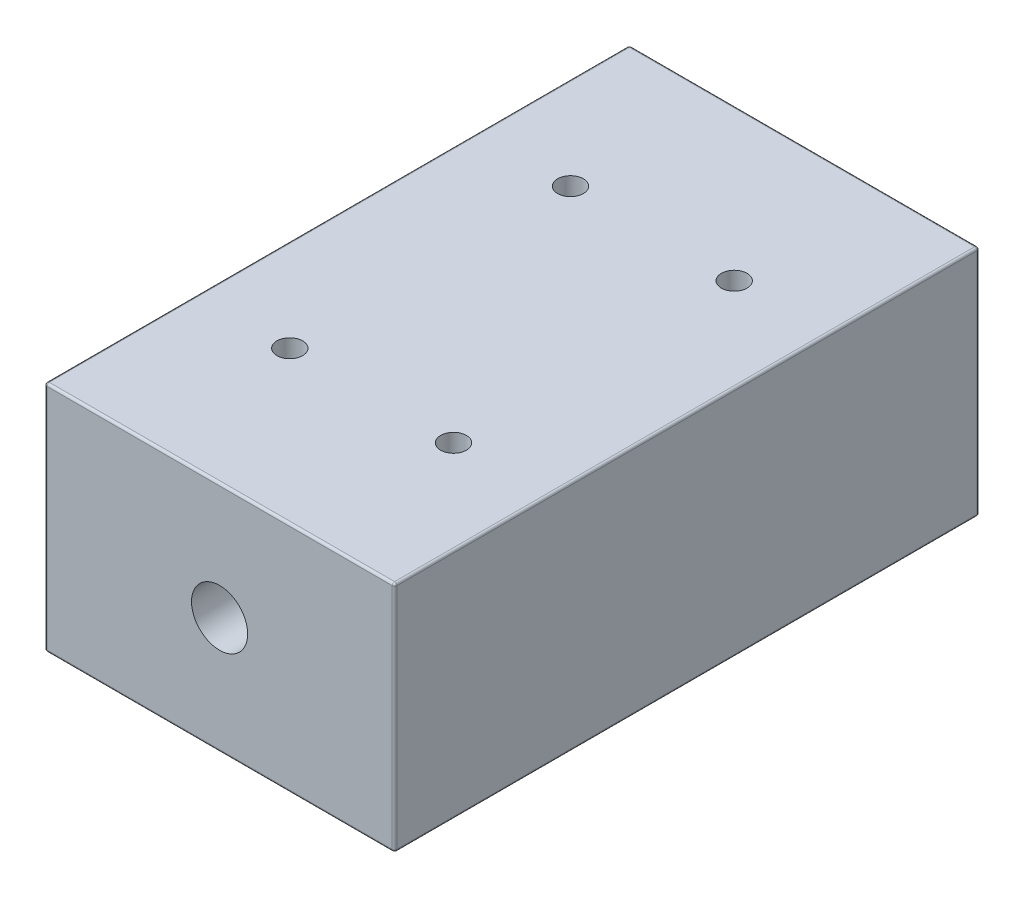
ISO-10303-21;
HEADER;
FILE_DESCRIPTION(('STEP AP214'),'2;1');
FILE_NAME('part.step','',(''),(''),'','','');
FILE_SCHEMA(('AUTOMOTIVE_DESIGN { 1 0 10303 214 1 1 1 1 }'));
ENDSEC;
DATA;
#1=APPLICATION_CONTEXT('core data for automotive mechanical design processes');
#2=APPLICATION_PROTOCOL_DEFINITION('international standard','automotive_design',2000,#1);
#3=PRODUCT_CONTEXT('',#1,'mechanical');
#4=PRODUCT('Part','Part','',(#3));
#5=PRODUCT_RELATED_PRODUCT_CATEGORY('part','',(#4));
#6=PRODUCT_DEFINITION_FORMATION('','',#4);
#7=PRODUCT_DEFINITION_CONTEXT('part definition',#1,'design');
#8=PRODUCT_DEFINITION('design','',#6,#7);
#9=PRODUCT_DEFINITION_SHAPE('','',#8);
#10=(LENGTH_UNIT() NAMED_UNIT(*) SI_UNIT(.MILLI.,.METRE.));
#11=(NAMED_UNIT(*) PLANE_ANGLE_UNIT() SI_UNIT($,.RADIAN.));
#12=(NAMED_UNIT(*) SI_UNIT($,.STERADIAN.) SOLID_ANGLE_UNIT());
#13=UNCERTAINTY_MEASURE_WITH_UNIT(LENGTH_MEASURE(1.E-05),#10,'distance_accuracy_value','');
#14=(GEOMETRIC_REPRESENTATION_CONTEXT(3) GLOBAL_UNCERTAINTY_ASSIGNED_CONTEXT((#13)) GLOBAL_UNIT_ASSIGNED_CONTEXT((#10,
#11,#12)) REPRESENTATION_CONTEXT('',''));
#15=CARTESIAN_POINT('',(0.,0.,0.));
#16=DIRECTION('',(0.,0.,1.));
#17=DIRECTION('',(1.,0.,0.));
#18=AXIS2_PLACEMENT_3D('',#15,#16,#17);
#19=CARTESIAN_POINT('',(54.9,49.8,32.5));
#20=DIRECTION('',(0.,1.,0.));
#21=DIRECTION('',(0.,0.,1.));
#22=AXIS2_PLACEMENT_3D('',#19,#20,#21);
#23=CYLINDRICAL_SURFACE('',#22,2.74999999999999);
#24=CARTESIAN_POINT('',(54.9,49.8,32.5));
#25=DIRECTION('',(0.,1.,0.));
#26=DIRECTION('',(0.,0.,1.));
#27=AXIS2_PLACEMENT_3D('',#24,#25,#26);
#28=CIRCLE('',#27,2.75);
#29=CARTESIAN_POINT('',(54.9,49.8,35.25));
#30=VERTEX_POINT('',#29);
#31=EDGE_CURVE('E290',#30,#30,#28,.T.);
#32=ORIENTED_EDGE('',*,*,#31,.T.);
#33=EDGE_LOOP('',(#32));
#34=FACE_BOUND('',#33,.T.);
#35=CARTESIAN_POINT('',(54.9,10.,32.5));
#36=DIRECTION('',(0.,-1.,0.));
#37=DIRECTION('',(0.,0.,-1.));
#38=AXIS2_PLACEMENT_3D('',#35,#36,#37);
#39=CIRCLE('',#38,2.74999999999999);
#40=CARTESIAN_POINT('',(54.9,10.,29.75));
#41=VERTEX_POINT('',#40);
#42=EDGE_CURVE('E37',#41,#41,#39,.F.);
#43=ORIENTED_EDGE('',*,*,#42,.F.);
#44=EDGE_LOOP('',(#43));
#45=FACE_BOUND('',#44,.T.);
#46=ADVANCED_FACE('F33',(#34,#45),#23,.F.);
#47=CARTESIAN_POINT('',(19.9,49.8,32.5));
#48=DIRECTION('',(0.,1.,0.));
#49=DIRECTION('',(0.,0.,1.));
#50=AXIS2_PLACEMENT_3D('',#47,#48,#49);
#51=CYLINDRICAL_SURFACE('',#50,2.74999999999999);
#52=CARTESIAN_POINT('',(19.9,49.8,32.5));
#53=DIRECTION('',(0.,1.,0.));
#54=DIRECTION('',(0.,0.,1.));
#55=AXIS2_PLACEMENT_3D('',#52,#53,#54);
#56=CIRCLE('',#55,2.74999999999999);
#57=CARTESIAN_POINT('',(19.9,49.8,35.25));
#58=VERTEX_POINT('',#57);
#59=EDGE_CURVE('E287',#58,#58,#56,.T.);
#60=ORIENTED_EDGE('',*,*,#59,.T.);
#61=EDGE_LOOP('',(#60));
#62=FACE_BOUND('',#61,.T.);
#63=CARTESIAN_POINT('',(19.9,10.,32.5));
#64=DIRECTION('',(0.,-1.,0.));
#65=DIRECTION('',(0.,0.,-1.));
#66=AXIS2_PLACEMENT_3D('',#63,#64,#65);
#67=CIRCLE('',#66,2.74999999999999);
#68=CARTESIAN_POINT('',(19.9,10.,29.75));
#69=VERTEX_POINT('',#68);
#70=EDGE_CURVE('E268',#69,#69,#67,.F.);
#71=ORIENTED_EDGE('',*,*,#70,.F.);
#72=EDGE_LOOP('',(#71));
#73=FACE_BOUND('',#72,.T.);
#74=ADVANCED_FACE('F327',(#62,#73),#51,.F.);
#75=CARTESIAN_POINT('',(54.9,49.8,92.5));
#76=DIRECTION('',(0.,1.,0.));
#77=DIRECTION('',(0.,0.,1.));
#78=AXIS2_PLACEMENT_3D('',#75,#76,#77);
#79=CYLINDRICAL_SURFACE('',#78,2.74999999999999);
#80=CARTESIAN_POINT('',(54.9,49.8,92.5));
#81=DIRECTION('',(0.,1.,0.));
#82=DIRECTION('',(0.,0.,1.));
#83=AXIS2_PLACEMENT_3D('',#80,#81,#82);
#84=CIRCLE('',#83,2.75);
#85=CARTESIAN_POINT('',(54.9,49.8,95.25));
#86=VERTEX_POINT('',#85);
#87=EDGE_CURVE('E264',#86,#86,#84,.T.);
#88=ORIENTED_EDGE('',*,*,#87,.T.);
#89=EDGE_LOOP('',(#88));
#90=FACE_BOUND('',#89,.T.);
#91=CARTESIAN_POINT('',(54.9,10.,92.5));
#92=DIRECTION('',(0.,-1.,0.));
#93=DIRECTION('',(0.,0.,-1.));
#94=AXIS2_PLACEMENT_3D('',#91,#92,#93);
#95=CIRCLE('',#94,2.74999999999999);
#96=CARTESIAN_POINT('',(54.9,10.,89.75));
#97=VERTEX_POINT('',#96);
#98=EDGE_CURVE('E266',#97,#97,#95,.F.);
#99=ORIENTED_EDGE('',*,*,#98,.F.);
#100=EDGE_LOOP('',(#99));
#101=FACE_BOUND('',#100,.T.);
#102=ADVANCED_FACE('F333',(#90,#101),#79,.F.);
#103=CARTESIAN_POINT('',(19.9,49.8,92.5));
#104=DIRECTION('',(0.,1.,0.));
#105=DIRECTION('',(0.,0.,1.));
#106=AXIS2_PLACEMENT_3D('',#103,#104,#105);
#107=CYLINDRICAL_SURFACE('',#106,2.74999999999999);
#108=CARTESIAN_POINT('',(19.9,49.8,92.5));
#109=DIRECTION('',(0.,1.,0.));
#110=DIRECTION('',(0.,0.,1.));
#111=AXIS2_PLACEMENT_3D('',#108,#109,#110);
#112=CIRCLE('',#111,2.74999999999999);
#113=CARTESIAN_POINT('',(19.9,49.8,95.25));
#114=VERTEX_POINT('',#113);
#115=EDGE_CURVE('E209',#114,#114,#112,.T.);
#116=ORIENTED_EDGE('',*,*,#115,.T.);
#117=EDGE_LOOP('',(#116));
#118=FACE_BOUND('',#117,.T.);
#119=CARTESIAN_POINT('',(19.9,10.,92.5));
#120=DIRECTION('',(0.,-1.,0.));
#121=DIRECTION('',(0.,0.,-1.));
#122=AXIS2_PLACEMENT_3D('',#119,#120,#121);
#123=CIRCLE('',#122,2.74999999999999);
#124=CARTESIAN_POINT('',(19.9,10.,89.75));
#125=VERTEX_POINT('',#124);
#126=EDGE_CURVE('E261',#125,#125,#123,.F.);
#127=ORIENTED_EDGE('',*,*,#126,.F.);
#128=EDGE_LOOP('',(#127));
#129=FACE_BOUND('',#128,.T.);
#130=ADVANCED_FACE('F339',(#118,#129),#107,.F.);
#131=CARTESIAN_POINT('',(0.,0.,125.));
#132=DIRECTION('',(1.,0.,0.));
#133=DIRECTION('',(0.,0.,-1.));
#134=AXIS2_PLACEMENT_3D('',#131,#132,#133);
#135=PLANE('',#134);
#136=DIRECTION('',(0.,-1.,0.));
#137=VECTOR('',#136,1.);
#138=CARTESIAN_POINT('',(0.,0.,0.5));
#139=LINE('',#138,#137);
#140=CARTESIAN_POINT('',(0.,49.3,0.5));
#141=VERTEX_POINT('',#140);
#142=CARTESIAN_POINT('',(0.,0.5,0.5));
#143=VERTEX_POINT('',#142);
#144=EDGE_CURVE('E169',#141,#143,#139,.T.);
#145=ORIENTED_EDGE('',*,*,#144,.T.);
#146=DIRECTION('',(0.,0.,-1.));
#147=VECTOR('',#146,1.);
#148=CARTESIAN_POINT('',(0.,0.5,125.));
#149=LINE('',#148,#147);
#150=CARTESIAN_POINT('',(0.,0.5,124.5));
#151=VERTEX_POINT('',#150);
#152=EDGE_CURVE('E174',#143,#151,#149,.F.);
#153=ORIENTED_EDGE('',*,*,#152,.T.);
#154=DIRECTION('',(0.,-1.,0.));
#155=VECTOR('',#154,1.);
#156=CARTESIAN_POINT('',(0.,0.,124.5));
#157=LINE('',#156,#155);
#158=CARTESIAN_POINT('',(0.,49.3,124.5));
#159=VERTEX_POINT('',#158);
#160=EDGE_CURVE('E171',#151,#159,#157,.F.);
#161=ORIENTED_EDGE('',*,*,#160,.T.);
#162=DIRECTION('',(0.,0.,-1.));
#163=VECTOR('',#162,1.);
#164=CARTESIAN_POINT('',(0.,49.3,125.));
#165=LINE('',#164,#163);
#166=EDGE_CURVE('E167',#159,#141,#165,.T.);
#167=ORIENTED_EDGE('',*,*,#166,.T.);
#168=EDGE_LOOP('',(#145,#153,#161,#167));
#169=FACE_BOUND('',#168,.T.);
#170=ADVANCED_FACE('F342',(#169),#135,.F.);
#171=CARTESIAN_POINT('',(0.,0.,125.));
#172=DIRECTION('',(0.,1.,0.));
#173=DIRECTION('',(0.,0.,1.));
#174=AXIS2_PLACEMENT_3D('',#171,#172,#173);
#175=PLANE('',#174);
#176=CARTESIAN_POINT('',(54.9,0.,92.5));
#177=DIRECTION('',(0.,-1.,0.));
#178=DIRECTION('',(0.,0.,-1.));
#179=AXIS2_PLACEMENT_3D('',#176,#177,#178);
#180=CIRCLE('',#179,6.);
#181=CARTESIAN_POINT('',(54.9,0.,86.5));
#182=VERTEX_POINT('',#181);
#183=EDGE_CURVE('E533',#182,#182,#180,.T.);
#184=ORIENTED_EDGE('',*,*,#183,.F.);
#185=EDGE_LOOP('',(#184));
#186=FACE_BOUND('',#185,.T.);
#187=CARTESIAN_POINT('',(54.9,0.,32.5));
#188=DIRECTION('',(0.,-1.,0.));
#189=DIRECTION('',(0.,0.,-1.));
#190=AXIS2_PLACEMENT_3D('',#187,#188,#189);
#191=CIRCLE('',#190,6.);
#192=CARTESIAN_POINT('',(54.9,0.,26.5));
#193=VERTEX_POINT('',#192);
#194=EDGE_CURVE('E523',#193,#193,#191,.T.);
#195=ORIENTED_EDGE('',*,*,#194,.F.);
#196=EDGE_LOOP('',(#195));
#197=FACE_BOUND('',#196,.T.);
#198=CARTESIAN_POINT('',(19.9,0.,32.5));
#199=DIRECTION('',(0.,-1.,0.));
#200=DIRECTION('',(0.,0.,-1.));
#201=AXIS2_PLACEMENT_3D('',#198,#199,#200);
#202=CIRCLE('',#201,6.);
#203=CARTESIAN_POINT('',(19.9,0.,26.5));
#204=VERTEX_POINT('',#203);
#205=EDGE_CURVE('E524',#204,#204,#202,.T.);
#206=ORIENTED_EDGE('',*,*,#205,.F.);
#207=EDGE_LOOP('',(#206));
#208=FACE_BOUND('',#207,.T.);
#209=CARTESIAN_POINT('',(19.9,0.,92.5));
#210=DIRECTION('',(0.,-1.,0.));
#211=DIRECTION('',(0.,0.,-1.));
#212=AXIS2_PLACEMENT_3D('',#209,#210,#211);
#213=CIRCLE('',#212,6.);
#214=CARTESIAN_POINT('',(19.9,0.,86.5));
#215=VERTEX_POINT('',#214);
#216=EDGE_CURVE('E274',#215,#215,#213,.T.);
#217=ORIENTED_EDGE('',*,*,#216,.F.);
#218=EDGE_LOOP('',(#217));
#219=FACE_BOUND('',#218,.T.);
#220=DIRECTION('',(1.,0.,0.));
#221=VECTOR('',#220,1.);
#222=CARTESIAN_POINT('',(0.,0.,124.5));
#223=LINE('',#222,#221);
#224=CARTESIAN_POINT('',(74.3,0.,124.5));
#225=VERTEX_POINT('',#224);
#226=CARTESIAN_POINT('',(0.5,0.,124.5));
#227=VERTEX_POINT('',#226);
#228=EDGE_CURVE('E189',#225,#227,#223,.F.);
#229=ORIENTED_EDGE('',*,*,#228,.T.);
#230=DIRECTION('',(0.,0.,-1.));
#231=VECTOR('',#230,1.);
#232=CARTESIAN_POINT('',(0.5,0.,125.));
#233=LINE('',#232,#231);
#234=CARTESIAN_POINT('',(0.5,0.,0.5));
#235=VERTEX_POINT('',#234);
#236=EDGE_CURVE('E191',#227,#235,#233,.T.);
#237=ORIENTED_EDGE('',*,*,#236,.T.);
#238=DIRECTION('',(1.,0.,0.));
#239=VECTOR('',#238,1.);
#240=CARTESIAN_POINT('',(74.8,0.,0.5));
#241=LINE('',#240,#239);
#242=CARTESIAN_POINT('',(74.3,0.,0.5));
#243=VERTEX_POINT('',#242);
#244=EDGE_CURVE('E187',#235,#243,#241,.T.);
#245=ORIENTED_EDGE('',*,*,#244,.T.);
#246=DIRECTION('',(0.,0.,-1.));
#247=VECTOR('',#246,1.);
#248=CARTESIAN_POINT('',(74.3,0.,125.));
#249=LINE('',#248,#247);
#250=EDGE_CURVE('E185',#243,#225,#249,.F.);
#251=ORIENTED_EDGE('',*,*,#250,.T.);
#252=EDGE_LOOP('',(#229,#237,#245,#251));
#253=FACE_BOUND('',#252,.T.);
#254=ADVANCED_FACE('F383',(#186,#197,#208,#219,#253),#175,.F.);
#255=CARTESIAN_POINT('',(74.8,0.,125.));
#256=DIRECTION('',(-1.,0.,0.));
#257=DIRECTION('',(0.,0.,1.));
#258=AXIS2_PLACEMENT_3D('',#255,#256,#257);
#259=PLANE('',#258);
#260=DIRECTION('',(0.,1.,0.));
#261=VECTOR('',#260,1.);
#262=CARTESIAN_POINT('',(74.8,0.,124.5));
#263=LINE('',#262,#261);
#264=CARTESIAN_POINT('',(74.8,49.3,124.5));
#265=VERTEX_POINT('',#264);
#266=CARTESIAN_POINT('',(74.8,0.5,124.5));
#267=VERTEX_POINT('',#266);
#268=EDGE_CURVE('E139',#265,#267,#263,.F.);
#269=ORIENTED_EDGE('',*,*,#268,.T.);
#270=DIRECTION('',(0.,0.,-1.));
#271=VECTOR('',#270,1.);
#272=CARTESIAN_POINT('',(74.8,0.5,125.));
#273=LINE('',#272,#271);
#274=CARTESIAN_POINT('',(74.8,0.5,0.5));
#275=VERTEX_POINT('',#274);
#276=EDGE_CURVE('E199',#267,#275,#273,.T.);
#277=ORIENTED_EDGE('',*,*,#276,.T.);
#278=DIRECTION('',(0.,1.,0.));
#279=VECTOR('',#278,1.);
#280=CARTESIAN_POINT('',(74.8,49.8,0.5));
#281=LINE('',#280,#279);
#282=CARTESIAN_POINT('',(74.8,49.3,0.5));
#283=VERTEX_POINT('',#282);
#284=EDGE_CURVE('E196',#275,#283,#281,.T.);
#285=ORIENTED_EDGE('',*,*,#284,.T.);
#286=DIRECTION('',(0.,0.,-1.));
#287=VECTOR('',#286,1.);
#288=CARTESIAN_POINT('',(74.8,49.3,125.));
#289=LINE('',#288,#287);
#290=EDGE_CURVE('E194',#283,#265,#289,.F.);
#291=ORIENTED_EDGE('',*,*,#290,.T.);
#292=EDGE_LOOP('',(#269,#277,#285,#291));
#293=FACE_BOUND('',#292,.T.);
#294=ADVANCED_FACE('F367',(#293),#259,.F.);
#295=CARTESIAN_POINT('',(0.,49.8,125.));
#296=DIRECTION('',(0.,-1.,0.));
#297=DIRECTION('',(0.,0.,-1.));
#298=AXIS2_PLACEMENT_3D('',#295,#296,#297);
#299=PLANE('',#298);
#300=ORIENTED_EDGE('',*,*,#87,.F.);
#301=EDGE_LOOP('',(#300));
#302=FACE_BOUND('',#301,.T.);
#303=ORIENTED_EDGE('',*,*,#59,.F.);
#304=EDGE_LOOP('',(#303));
#305=FACE_BOUND('',#304,.T.);
#306=ORIENTED_EDGE('',*,*,#31,.F.);
#307=EDGE_LOOP('',(#306));
#308=FACE_BOUND('',#307,.T.);
#309=ORIENTED_EDGE('',*,*,#115,.F.);
#310=EDGE_LOOP('',(#309));
#311=FACE_BOUND('',#310,.T.);
#312=DIRECTION('',(-1.,0.,0.));
#313=VECTOR('',#312,1.);
#314=CARTESIAN_POINT('',(0.,49.8,124.5));
#315=LINE('',#314,#313);
#316=CARTESIAN_POINT('',(0.5,49.8,124.5));
#317=VERTEX_POINT('',#316);
#318=CARTESIAN_POINT('',(74.3,49.8,124.5));
#319=VERTEX_POINT('',#318);
#320=EDGE_CURVE('E42',#317,#319,#315,.F.);
#321=ORIENTED_EDGE('',*,*,#320,.T.);
#322=DIRECTION('',(0.,0.,-1.));
#323=VECTOR('',#322,1.);
#324=CARTESIAN_POINT('',(74.3,49.8,125.));
#325=LINE('',#324,#323);
#326=CARTESIAN_POINT('',(74.3,49.8,0.5));
#327=VERTEX_POINT('',#326);
#328=EDGE_CURVE('E11',#319,#327,#325,.T.);
#329=ORIENTED_EDGE('',*,*,#328,.T.);
#330=DIRECTION('',(-1.,0.,0.));
#331=VECTOR('',#330,1.);
#332=CARTESIAN_POINT('',(0.,49.8,0.5));
#333=LINE('',#332,#331);
#334=CARTESIAN_POINT('',(0.5,49.8,0.5));
#335=VERTEX_POINT('',#334);
#336=EDGE_CURVE('E202',#327,#335,#333,.T.);
#337=ORIENTED_EDGE('',*,*,#336,.T.);
#338=DIRECTION('',(0.,0.,-1.));
#339=VECTOR('',#338,1.);
#340=CARTESIAN_POINT('',(0.5,49.8,125.));
#341=LINE('',#340,#339);
#342=EDGE_CURVE('E53',#335,#317,#341,.F.);
#343=ORIENTED_EDGE('',*,*,#342,.T.);
#344=EDGE_LOOP('',(#321,#329,#337,#343));
#345=FACE_BOUND('',#344,.T.);
#346=ADVANCED_FACE('F323',(#302,#305,#308,#311,#345),#299,.F.);
#347=CARTESIAN_POINT('',(0.,0.,125.));
#348=DIRECTION('',(0.,0.,-1.));
#349=DIRECTION('',(-1.,0.,0.));
#350=AXIS2_PLACEMENT_3D('',#347,#348,#349);
#351=PLANE('',#350);
#352=DIRECTION('',(-1.,0.,0.));
#353=VECTOR('',#352,1.);
#354=CARTESIAN_POINT('',(0.,49.3,125.));
#355=LINE('',#354,#353);
#356=CARTESIAN_POINT('',(74.3,49.3,125.));
#357=VERTEX_POINT('',#356);
#358=CARTESIAN_POINT('',(0.5,49.3,125.));
#359=VERTEX_POINT('',#358);
#360=EDGE_CURVE('E126',#357,#359,#355,.T.);
#361=ORIENTED_EDGE('',*,*,#360,.T.);
#362=DIRECTION('',(0.,-1.,0.));
#363=VECTOR('',#362,1.);
#364=CARTESIAN_POINT('',(0.5,0.,125.));
#365=LINE('',#364,#363);
#366=CARTESIAN_POINT('',(0.5,0.5,125.));
#367=VERTEX_POINT('',#366);
#368=EDGE_CURVE('E165',#359,#367,#365,.T.);
#369=ORIENTED_EDGE('',*,*,#368,.T.);
#370=DIRECTION('',(1.,0.,0.));
#371=VECTOR('',#370,1.);
#372=CARTESIAN_POINT('',(0.,0.5,125.));
#373=LINE('',#372,#371);
#374=CARTESIAN_POINT('',(74.3,0.5,125.));
#375=VERTEX_POINT('',#374);
#376=EDGE_CURVE('E129',#367,#375,#373,.T.);
#377=ORIENTED_EDGE('',*,*,#376,.T.);
#378=DIRECTION('',(0.,1.,0.));
#379=VECTOR('',#378,1.);
#380=CARTESIAN_POINT('',(74.3,0.,125.));
#381=LINE('',#380,#379);
#382=EDGE_CURVE('E120',#375,#357,#381,.T.);
#383=ORIENTED_EDGE('',*,*,#382,.T.);
#384=EDGE_LOOP('',(#361,#369,#377,#383));
#385=FACE_BOUND('',#384,.T.);
#386=CARTESIAN_POINT('',(37.4,24.9,125.));
#387=DIRECTION('',(0.,0.,-1.));
#388=DIRECTION('',(-1.,0.,0.));
#389=AXIS2_PLACEMENT_3D('',#386,#387,#388);
#390=CIRCLE('',#389,5.99999999999999);
#391=CARTESIAN_POINT('',(31.4,24.9,125.));
#392=VERTEX_POINT('',#391);
#393=EDGE_CURVE('E295',#392,#392,#390,.T.);
#394=ORIENTED_EDGE('',*,*,#393,.T.);
#395=EDGE_LOOP('',(#394));
#396=FACE_BOUND('',#395,.T.);
#397=ADVANCED_FACE('F122',(#385,#396),#351,.F.);
#398=CARTESIAN_POINT('',(0.,0.,0.));
#399=DIRECTION('',(0.,0.,-1.));
#400=DIRECTION('',(-1.,0.,0.));
#401=AXIS2_PLACEMENT_3D('',#398,#399,#400);
#402=PLANE('',#401);
#403=DIRECTION('',(1.,0.,0.));
#404=VECTOR('',#403,1.);
#405=CARTESIAN_POINT('',(0.,0.5,0.));
#406=LINE('',#405,#404);
#407=CARTESIAN_POINT('',(74.3,0.5,0.));
#408=VERTEX_POINT('',#407);
#409=CARTESIAN_POINT('',(0.5,0.5,0.));
#410=VERTEX_POINT('',#409);
#411=EDGE_CURVE('E180',#408,#410,#406,.F.);
#412=ORIENTED_EDGE('',*,*,#411,.T.);
#413=DIRECTION('',(0.,-1.,0.));
#414=VECTOR('',#413,1.);
#415=CARTESIAN_POINT('',(0.5,49.8,0.));
#416=LINE('',#415,#414);
#417=CARTESIAN_POINT('',(0.5,49.3,0.));
#418=VERTEX_POINT('',#417);
#419=EDGE_CURVE('E182',#410,#418,#416,.F.);
#420=ORIENTED_EDGE('',*,*,#419,.T.);
#421=DIRECTION('',(-1.,0.,0.));
#422=VECTOR('',#421,1.);
#423=CARTESIAN_POINT('',(74.8,49.3,0.));
#424=LINE('',#423,#422);
#425=CARTESIAN_POINT('',(74.3,49.3,0.));
#426=VERTEX_POINT('',#425);
#427=EDGE_CURVE('E176',#418,#426,#424,.F.);
#428=ORIENTED_EDGE('',*,*,#427,.T.);
#429=DIRECTION('',(0.,1.,0.));
#430=VECTOR('',#429,1.);
#431=CARTESIAN_POINT('',(74.3,0.,0.));
#432=LINE('',#431,#430);
#433=EDGE_CURVE('E178',#426,#408,#432,.F.);
#434=ORIENTED_EDGE('',*,*,#433,.T.);
#435=EDGE_LOOP('',(#412,#420,#428,#434));
#436=FACE_BOUND('',#435,.T.);
#437=CARTESIAN_POINT('',(37.4,24.9,0.));
#438=DIRECTION('',(0.,0.,-1.));
#439=DIRECTION('',(-1.,0.,0.));
#440=AXIS2_PLACEMENT_3D('',#437,#438,#439);
#441=CIRCLE('',#440,11.);
#442=CARTESIAN_POINT('',(26.4,24.9,0.));
#443=VERTEX_POINT('',#442);
#444=EDGE_CURVE('E160',#443,#443,#441,.T.);
#445=ORIENTED_EDGE('',*,*,#444,.F.);
#446=EDGE_LOOP('',(#445));
#447=FACE_BOUND('',#446,.T.);
#448=ADVANCED_FACE('F312',(#436,#447),#402,.T.);
#449=CARTESIAN_POINT('',(37.4,24.9,15.));
#450=DIRECTION('',(0.,0.,-1.));
#451=DIRECTION('',(-1.,0.,0.));
#452=AXIS2_PLACEMENT_3D('',#449,#450,#451);
#453=CYLINDRICAL_SURFACE('',#452,11.);
#454=CARTESIAN_POINT('',(37.4,24.9,15.));
#455=DIRECTION('',(0.,0.,-1.));
#456=DIRECTION('',(-1.,0.,0.));
#457=AXIS2_PLACEMENT_3D('',#454,#455,#456);
#458=CIRCLE('',#457,11.);
#459=CARTESIAN_POINT('',(26.4,24.9,15.));
#460=VERTEX_POINT('',#459);
#461=EDGE_CURVE('E157',#460,#460,#458,.T.);
#462=ORIENTED_EDGE('',*,*,#461,.F.);
#463=EDGE_LOOP('',(#462));
#464=FACE_BOUND('',#463,.T.);
#465=ORIENTED_EDGE('',*,*,#444,.T.);
#466=EDGE_LOOP('',(#465));
#467=FACE_BOUND('',#466,.T.);
#468=ADVANCED_FACE('F306',(#464,#467),#453,.F.);
#469=CARTESIAN_POINT('',(37.4,24.9,15.));
#470=DIRECTION('',(0.,0.,-1.));
#471=DIRECTION('',(-1.,0.,0.));
#472=AXIS2_PLACEMENT_3D('',#469,#470,#471);
#473=PLANE('',#472);
#474=CARTESIAN_POINT('',(37.4,24.9,15.));
#475=DIRECTION('',(0.,0.,-1.));
#476=DIRECTION('',(-1.,0.,0.));
#477=AXIS2_PLACEMENT_3D('',#474,#475,#476);
#478=CIRCLE('',#477,5.99999999999999);
#479=CARTESIAN_POINT('',(31.4,24.9,15.));
#480=VERTEX_POINT('',#479);
#481=EDGE_CURVE('E260',#480,#480,#478,.T.);
#482=ORIENTED_EDGE('',*,*,#481,.F.);
#483=EDGE_LOOP('',(#482));
#484=FACE_BOUND('',#483,.T.);
#485=ORIENTED_EDGE('',*,*,#461,.T.);
#486=EDGE_LOOP('',(#485));
#487=FACE_BOUND('',#486,.T.);
#488=ADVANCED_FACE('F303',(#484,#487),#473,.T.);
#489=CARTESIAN_POINT('',(37.4,24.9,125.));
#490=DIRECTION('',(0.,0.,-1.));
#491=DIRECTION('',(-1.,0.,0.));
#492=AXIS2_PLACEMENT_3D('',#489,#490,#491);
#493=CYLINDRICAL_SURFACE('',#492,5.99999999999999);
#494=ORIENTED_EDGE('',*,*,#393,.F.);
#495=EDGE_LOOP('',(#494));
#496=FACE_BOUND('',#495,.T.);
#497=ORIENTED_EDGE('',*,*,#481,.T.);
#498=EDGE_LOOP('',(#497));
#499=FACE_BOUND('',#498,.T.);
#500=ADVANCED_FACE('F301',(#496,#499),#493,.F.);
#501=CARTESIAN_POINT('',(74.3,0.,0.5));
#502=DIRECTION('',(0.,-1.,0.));
#503=DIRECTION('',(0.,0.,-1.));
#504=AXIS2_PLACEMENT_3D('',#501,#502,#503);
#505=CYLINDRICAL_SURFACE('',#504,0.5);
#506=CARTESIAN_POINT('',(74.3,49.3,0.5));
#507=DIRECTION('',(0.,1.,0.));
#508=DIRECTION('',(0.,0.,1.));
#509=AXIS2_PLACEMENT_3D('',#506,#507,#508);
#510=CIRCLE('',#509,0.5);
#511=EDGE_CURVE('E257',#283,#426,#510,.T.);
#512=ORIENTED_EDGE('',*,*,#511,.F.);
#513=ORIENTED_EDGE('',*,*,#284,.F.);
#514=CARTESIAN_POINT('',(74.3,0.5,0.5));
#515=DIRECTION('',(0.,-1.,0.));
#516=DIRECTION('',(0.,0.,-1.));
#517=AXIS2_PLACEMENT_3D('',#514,#515,#516);
#518=CIRCLE('',#517,0.5);
#519=EDGE_CURVE('E254',#408,#275,#518,.T.);
#520=ORIENTED_EDGE('',*,*,#519,.F.);
#521=ORIENTED_EDGE('',*,*,#433,.F.);
#522=EDGE_LOOP('',(#512,#513,#520,#521));
#523=FACE_BOUND('',#522,.T.);
#524=ADVANCED_FACE('F35',(#523),#505,.T.);
#525=CARTESIAN_POINT('',(74.3,49.3,0.5));
#526=DIRECTION('',(0.,0.,1.));
#527=DIRECTION('',(1.,0.,0.));
#528=AXIS2_PLACEMENT_3D('',#525,#526,#527);
#529=SPHERICAL_SURFACE('',#528,0.5);
#530=CARTESIAN_POINT('',(74.3,49.3,0.5));
#531=DIRECTION('',(0.,0.,-1.));
#532=DIRECTION('',(-1.,0.,0.));
#533=AXIS2_PLACEMENT_3D('',#530,#531,#532);
#534=CIRCLE('',#533,0.5);
#535=EDGE_CURVE('E248',#283,#327,#534,.F.);
#536=ORIENTED_EDGE('',*,*,#535,.F.);
#537=ORIENTED_EDGE('',*,*,#511,.T.);
#538=CARTESIAN_POINT('',(74.3,49.3,0.5));
#539=DIRECTION('',(1.,0.,0.));
#540=DIRECTION('',(0.,0.,-1.));
#541=AXIS2_PLACEMENT_3D('',#538,#539,#540);
#542=CIRCLE('',#541,0.5);
#543=EDGE_CURVE('E251',#327,#426,#542,.F.);
#544=ORIENTED_EDGE('',*,*,#543,.F.);
#545=EDGE_LOOP('',(#536,#537,#544));
#546=FACE_BOUND('',#545,.T.);
#547=ADVANCED_FACE('F349',(#546),#529,.T.);
#548=CARTESIAN_POINT('',(74.3,0.5,0.5));
#549=DIRECTION('',(0.,0.,1.));
#550=DIRECTION('',(1.,0.,0.));
#551=AXIS2_PLACEMENT_3D('',#548,#549,#550);
#552=SPHERICAL_SURFACE('',#551,0.5);
#553=CARTESIAN_POINT('',(74.3,0.5,0.5));
#554=DIRECTION('',(1.,0.,0.));
#555=DIRECTION('',(0.,0.,-1.));
#556=AXIS2_PLACEMENT_3D('',#553,#554,#555);
#557=CIRCLE('',#556,0.5);
#558=EDGE_CURVE('E243',#408,#243,#557,.F.);
#559=ORIENTED_EDGE('',*,*,#558,.F.);
#560=ORIENTED_EDGE('',*,*,#519,.T.);
#561=CARTESIAN_POINT('',(74.3,0.5,0.5));
#562=DIRECTION('',(0.,0.,-1.));
#563=DIRECTION('',(-1.,0.,0.));
#564=AXIS2_PLACEMENT_3D('',#561,#562,#563);
#565=CIRCLE('',#564,0.5);
#566=EDGE_CURVE('E246',#243,#275,#565,.F.);
#567=ORIENTED_EDGE('',*,*,#566,.F.);
#568=EDGE_LOOP('',(#559,#560,#567));
#569=FACE_BOUND('',#568,.T.);
#570=ADVANCED_FACE('F355',(#569),#552,.T.);
#571=CARTESIAN_POINT('',(0.,49.3,0.5));
#572=DIRECTION('',(1.,0.,0.));
#573=DIRECTION('',(0.,0.,-1.));
#574=AXIS2_PLACEMENT_3D('',#571,#572,#573);
#575=CYLINDRICAL_SURFACE('',#574,0.5);
#576=ORIENTED_EDGE('',*,*,#543,.T.);
#577=ORIENTED_EDGE('',*,*,#427,.F.);
#578=CARTESIAN_POINT('',(0.5,49.3,0.5));
#579=DIRECTION('',(-1.,0.,0.));
#580=DIRECTION('',(0.,0.,1.));
#581=AXIS2_PLACEMENT_3D('',#578,#579,#580);
#582=CIRCLE('',#581,0.5);
#583=EDGE_CURVE('E238',#335,#418,#582,.T.);
#584=ORIENTED_EDGE('',*,*,#583,.F.);
#585=ORIENTED_EDGE('',*,*,#336,.F.);
#586=EDGE_LOOP('',(#576,#577,#584,#585));
#587=FACE_BOUND('',#586,.T.);
#588=ADVANCED_FACE('F401',(#587),#575,.T.);
#589=CARTESIAN_POINT('',(74.3,49.3,125.));
#590=DIRECTION('',(0.,0.,-1.));
#591=DIRECTION('',(-1.,0.,0.));
#592=AXIS2_PLACEMENT_3D('',#589,#590,#591);
#593=CYLINDRICAL_SURFACE('',#592,0.5);
#594=ORIENTED_EDGE('',*,*,#535,.T.);
#595=ORIENTED_EDGE('',*,*,#328,.F.);
#596=CARTESIAN_POINT('',(74.3,49.3,124.5));
#597=DIRECTION('',(0.,0.,1.));
#598=DIRECTION('',(1.,0.,0.));
#599=AXIS2_PLACEMENT_3D('',#596,#597,#598);
#600=CIRCLE('',#599,0.5);
#601=EDGE_CURVE('E143',#265,#319,#600,.T.);
#602=ORIENTED_EDGE('',*,*,#601,.F.);
#603=ORIENTED_EDGE('',*,*,#290,.F.);
#604=EDGE_LOOP('',(#594,#595,#602,#603));
#605=FACE_BOUND('',#604,.T.);
#606=ADVANCED_FACE('F365',(#605),#593,.T.);
#607=CARTESIAN_POINT('',(74.3,0.,124.5));
#608=DIRECTION('',(0.,1.,0.));
#609=DIRECTION('',(0.,0.,1.));
#610=AXIS2_PLACEMENT_3D('',#607,#608,#609);
#611=CYLINDRICAL_SURFACE('',#610,0.5);
#612=CARTESIAN_POINT('',(74.3,0.5,124.5));
#613=DIRECTION('',(0.,-1.,0.));
#614=DIRECTION('',(0.,0.,-1.));
#615=AXIS2_PLACEMENT_3D('',#612,#613,#614);
#616=CIRCLE('',#615,0.5);
#617=EDGE_CURVE('E144',#267,#375,#616,.T.);
#618=ORIENTED_EDGE('',*,*,#617,.F.);
#619=ORIENTED_EDGE('',*,*,#268,.F.);
#620=CARTESIAN_POINT('',(74.3,49.3,124.5));
#621=DIRECTION('',(0.,1.,0.));
#622=DIRECTION('',(0.,0.,1.));
#623=AXIS2_PLACEMENT_3D('',#620,#621,#622);
#624=CIRCLE('',#623,0.5);
#625=EDGE_CURVE('E136',#357,#265,#624,.T.);
#626=ORIENTED_EDGE('',*,*,#625,.F.);
#627=ORIENTED_EDGE('',*,*,#382,.F.);
#628=EDGE_LOOP('',(#618,#619,#626,#627));
#629=FACE_BOUND('',#628,.T.);
#630=ADVANCED_FACE('F138',(#629),#611,.T.);
#631=CARTESIAN_POINT('',(74.3,0.5,125.));
#632=DIRECTION('',(0.,0.,-1.));
#633=DIRECTION('',(-1.,0.,0.));
#634=AXIS2_PLACEMENT_3D('',#631,#632,#633);
#635=CYLINDRICAL_SURFACE('',#634,0.5);
#636=ORIENTED_EDGE('',*,*,#566,.T.);
#637=ORIENTED_EDGE('',*,*,#276,.F.);
#638=CARTESIAN_POINT('',(74.3,0.5,124.5));
#639=DIRECTION('',(0.,0.,1.));
#640=DIRECTION('',(1.,0.,0.));
#641=AXIS2_PLACEMENT_3D('',#638,#639,#640);
#642=CIRCLE('',#641,0.5);
#643=EDGE_CURVE('E233',#225,#267,#642,.T.);
#644=ORIENTED_EDGE('',*,*,#643,.F.);
#645=ORIENTED_EDGE('',*,*,#250,.F.);
#646=EDGE_LOOP('',(#636,#637,#644,#645));
#647=FACE_BOUND('',#646,.T.);
#648=ADVANCED_FACE('F371',(#647),#635,.T.);
#649=CARTESIAN_POINT('',(0.,0.5,0.5));
#650=DIRECTION('',(-1.,0.,0.));
#651=DIRECTION('',(0.,0.,1.));
#652=AXIS2_PLACEMENT_3D('',#649,#650,#651);
#653=CYLINDRICAL_SURFACE('',#652,0.5);
#654=ORIENTED_EDGE('',*,*,#558,.T.);
#655=ORIENTED_EDGE('',*,*,#244,.F.);
#656=CARTESIAN_POINT('',(0.5,0.5,0.5));
#657=DIRECTION('',(-1.,0.,0.));
#658=DIRECTION('',(0.,0.,1.));
#659=AXIS2_PLACEMENT_3D('',#656,#657,#658);
#660=CIRCLE('',#659,0.5);
#661=EDGE_CURVE('E230',#410,#235,#660,.T.);
#662=ORIENTED_EDGE('',*,*,#661,.F.);
#663=ORIENTED_EDGE('',*,*,#411,.F.);
#664=EDGE_LOOP('',(#654,#655,#662,#663));
#665=FACE_BOUND('',#664,.T.);
#666=ADVANCED_FACE('F397',(#665),#653,.T.);
#667=CARTESIAN_POINT('',(0.5,0.,0.5));
#668=DIRECTION('',(0.,1.,0.));
#669=DIRECTION('',(0.,0.,1.));
#670=AXIS2_PLACEMENT_3D('',#667,#668,#669);
#671=CYLINDRICAL_SURFACE('',#670,0.5);
#672=CARTESIAN_POINT('',(0.5,49.3,0.5));
#673=DIRECTION('',(0.,1.,0.));
#674=DIRECTION('',(0.,0.,1.));
#675=AXIS2_PLACEMENT_3D('',#672,#673,#674);
#676=CIRCLE('',#675,0.5);
#677=EDGE_CURVE('E240',#418,#141,#676,.T.);
#678=ORIENTED_EDGE('',*,*,#677,.F.);
#679=ORIENTED_EDGE('',*,*,#419,.F.);
#680=CARTESIAN_POINT('',(0.5,0.5,0.5));
#681=DIRECTION('',(0.,-1.,0.));
#682=DIRECTION('',(0.,0.,-1.));
#683=AXIS2_PLACEMENT_3D('',#680,#681,#682);
#684=CIRCLE('',#683,0.5);
#685=EDGE_CURVE('E227',#143,#410,#684,.T.);
#686=ORIENTED_EDGE('',*,*,#685,.F.);
#687=ORIENTED_EDGE('',*,*,#144,.F.);
#688=EDGE_LOOP('',(#678,#679,#686,#687));
#689=FACE_BOUND('',#688,.T.);
#690=ADVANCED_FACE('F417',(#689),#671,.T.);
#691=CARTESIAN_POINT('',(0.5,49.3,0.5));
#692=DIRECTION('',(0.,0.,1.));
#693=DIRECTION('',(1.,0.,0.));
#694=AXIS2_PLACEMENT_3D('',#691,#692,#693);
#695=SPHERICAL_SURFACE('',#694,0.5);
#696=ORIENTED_EDGE('',*,*,#583,.T.);
#697=ORIENTED_EDGE('',*,*,#677,.T.);
#698=CARTESIAN_POINT('',(0.5,49.3,0.5));
#699=DIRECTION('',(0.,0.,-1.));
#700=DIRECTION('',(-1.,0.,0.));
#701=AXIS2_PLACEMENT_3D('',#698,#699,#700);
#702=CIRCLE('',#701,0.5);
#703=EDGE_CURVE('E150',#335,#141,#702,.F.);
#704=ORIENTED_EDGE('',*,*,#703,.F.);
#705=EDGE_LOOP('',(#696,#697,#704));
#706=FACE_BOUND('',#705,.T.);
#707=ADVANCED_FACE('F420',(#706),#695,.T.);
#708=CARTESIAN_POINT('',(74.3,49.3,124.5));
#709=DIRECTION('',(0.,0.,1.));
#710=DIRECTION('',(1.,0.,0.));
#711=AXIS2_PLACEMENT_3D('',#708,#709,#710);
#712=SPHERICAL_SURFACE('',#711,0.5);
#713=ORIENTED_EDGE('',*,*,#625,.T.);
#714=ORIENTED_EDGE('',*,*,#601,.T.);
#715=CARTESIAN_POINT('',(74.3,49.3,124.5));
#716=DIRECTION('',(1.,0.,0.));
#717=DIRECTION('',(0.,0.,-1.));
#718=AXIS2_PLACEMENT_3D('',#715,#716,#717);
#719=CIRCLE('',#718,0.5);
#720=EDGE_CURVE('E147',#357,#319,#719,.F.);
#721=ORIENTED_EDGE('',*,*,#720,.F.);
#722=EDGE_LOOP('',(#713,#714,#721));
#723=FACE_BOUND('',#722,.T.);
#724=ADVANCED_FACE('F148',(#723),#712,.T.);
#725=CARTESIAN_POINT('',(74.3,0.5,124.5));
#726=DIRECTION('',(0.,0.,1.));
#727=DIRECTION('',(1.,0.,0.));
#728=AXIS2_PLACEMENT_3D('',#725,#726,#727);
#729=SPHERICAL_SURFACE('',#728,0.5);
#730=ORIENTED_EDGE('',*,*,#643,.T.);
#731=ORIENTED_EDGE('',*,*,#617,.T.);
#732=CARTESIAN_POINT('',(74.3,0.5,124.5));
#733=DIRECTION('',(1.,0.,0.));
#734=DIRECTION('',(0.,0.,-1.));
#735=AXIS2_PLACEMENT_3D('',#732,#733,#734);
#736=CIRCLE('',#735,0.5);
#737=EDGE_CURVE('E151',#225,#375,#736,.F.);
#738=ORIENTED_EDGE('',*,*,#737,.F.);
#739=EDGE_LOOP('',(#730,#731,#738));
#740=FACE_BOUND('',#739,.T.);
#741=ADVANCED_FACE('F376',(#740),#729,.T.);
#742=CARTESIAN_POINT('',(0.5,0.5,0.5));
#743=DIRECTION('',(0.,0.,1.));
#744=DIRECTION('',(1.,0.,0.));
#745=AXIS2_PLACEMENT_3D('',#742,#743,#744);
#746=SPHERICAL_SURFACE('',#745,0.5);
#747=ORIENTED_EDGE('',*,*,#685,.T.);
#748=ORIENTED_EDGE('',*,*,#661,.T.);
#749=CARTESIAN_POINT('',(0.5,0.5,0.5));
#750=DIRECTION('',(0.,0.,-1.));
#751=DIRECTION('',(-1.,0.,0.));
#752=AXIS2_PLACEMENT_3D('',#749,#750,#751);
#753=CIRCLE('',#752,0.5);
#754=EDGE_CURVE('E221',#143,#235,#753,.F.);
#755=ORIENTED_EDGE('',*,*,#754,.F.);
#756=EDGE_LOOP('',(#747,#748,#755));
#757=FACE_BOUND('',#756,.T.);
#758=ADVANCED_FACE('F393',(#757),#746,.T.);
#759=CARTESIAN_POINT('',(0.5,49.3,125.));
#760=DIRECTION('',(0.,0.,-1.));
#761=DIRECTION('',(-1.,0.,0.));
#762=AXIS2_PLACEMENT_3D('',#759,#760,#761);
#763=CYLINDRICAL_SURFACE('',#762,0.5);
#764=ORIENTED_EDGE('',*,*,#703,.T.);
#765=ORIENTED_EDGE('',*,*,#166,.F.);
#766=CARTESIAN_POINT('',(0.5,49.3,124.5));
#767=DIRECTION('',(0.,0.,1.));
#768=DIRECTION('',(1.,0.,0.));
#769=AXIS2_PLACEMENT_3D('',#766,#767,#768);
#770=CIRCLE('',#769,0.5);
#771=EDGE_CURVE('E218',#317,#159,#770,.T.);
#772=ORIENTED_EDGE('',*,*,#771,.F.);
#773=ORIENTED_EDGE('',*,*,#342,.F.);
#774=EDGE_LOOP('',(#764,#765,#772,#773));
#775=FACE_BOUND('',#774,.T.);
#776=ADVANCED_FACE('F431',(#775),#763,.T.);
#777=CARTESIAN_POINT('',(0.,49.3,124.5));
#778=DIRECTION('',(-1.,0.,0.));
#779=DIRECTION('',(0.,0.,1.));
#780=AXIS2_PLACEMENT_3D('',#777,#778,#779);
#781=CYLINDRICAL_SURFACE('',#780,0.5);
#782=ORIENTED_EDGE('',*,*,#720,.T.);
#783=ORIENTED_EDGE('',*,*,#320,.F.);
#784=CARTESIAN_POINT('',(0.5,49.3,124.5));
#785=DIRECTION('',(-1.,0.,0.));
#786=DIRECTION('',(0.,0.,1.));
#787=AXIS2_PLACEMENT_3D('',#784,#785,#786);
#788=CIRCLE('',#787,0.5);
#789=EDGE_CURVE('E155',#359,#317,#788,.T.);
#790=ORIENTED_EDGE('',*,*,#789,.F.);
#791=ORIENTED_EDGE('',*,*,#360,.F.);
#792=EDGE_LOOP('',(#782,#783,#790,#791));
#793=FACE_BOUND('',#792,.T.);
#794=ADVANCED_FACE('F153',(#793),#781,.T.);
#795=CARTESIAN_POINT('',(0.,0.5,124.5));
#796=DIRECTION('',(1.,0.,0.));
#797=DIRECTION('',(0.,0.,-1.));
#798=AXIS2_PLACEMENT_3D('',#795,#796,#797);
#799=CYLINDRICAL_SURFACE('',#798,0.5);
#800=ORIENTED_EDGE('',*,*,#737,.T.);
#801=ORIENTED_EDGE('',*,*,#376,.F.);
#802=CARTESIAN_POINT('',(0.5,0.5,124.5));
#803=DIRECTION('',(-1.,0.,0.));
#804=DIRECTION('',(0.,0.,1.));
#805=AXIS2_PLACEMENT_3D('',#802,#803,#804);
#806=CIRCLE('',#805,0.5);
#807=EDGE_CURVE('E214',#227,#367,#806,.T.);
#808=ORIENTED_EDGE('',*,*,#807,.F.);
#809=ORIENTED_EDGE('',*,*,#228,.F.);
#810=EDGE_LOOP('',(#800,#801,#808,#809));
#811=FACE_BOUND('',#810,.T.);
#812=ADVANCED_FACE('F380',(#811),#799,.T.);
#813=CARTESIAN_POINT('',(0.5,0.5,125.));
#814=DIRECTION('',(0.,0.,-1.));
#815=DIRECTION('',(-1.,0.,0.));
#816=AXIS2_PLACEMENT_3D('',#813,#814,#815);
#817=CYLINDRICAL_SURFACE('',#816,0.5);
#818=ORIENTED_EDGE('',*,*,#754,.T.);
#819=ORIENTED_EDGE('',*,*,#236,.F.);
#820=CARTESIAN_POINT('',(0.5,0.5,124.5));
#821=DIRECTION('',(0.,0.,1.));
#822=DIRECTION('',(1.,0.,0.));
#823=AXIS2_PLACEMENT_3D('',#820,#821,#822);
#824=CIRCLE('',#823,0.5);
#825=EDGE_CURVE('E211',#151,#227,#824,.T.);
#826=ORIENTED_EDGE('',*,*,#825,.F.);
#827=ORIENTED_EDGE('',*,*,#152,.F.);
#828=EDGE_LOOP('',(#818,#819,#826,#827));
#829=FACE_BOUND('',#828,.T.);
#830=ADVANCED_FACE('F386',(#829),#817,.T.);
#831=CARTESIAN_POINT('',(0.5,49.3,124.5));
#832=DIRECTION('',(0.,0.,1.));
#833=DIRECTION('',(1.,0.,0.));
#834=AXIS2_PLACEMENT_3D('',#831,#832,#833);
#835=SPHERICAL_SURFACE('',#834,0.5);
#836=ORIENTED_EDGE('',*,*,#789,.T.);
#837=ORIENTED_EDGE('',*,*,#771,.T.);
#838=CARTESIAN_POINT('',(0.5,49.3,124.5));
#839=DIRECTION('',(0.,1.,0.));
#840=DIRECTION('',(0.,0.,1.));
#841=AXIS2_PLACEMENT_3D('',#838,#839,#840);
#842=CIRCLE('',#841,0.5);
#843=EDGE_CURVE('E208',#359,#159,#842,.F.);
#844=ORIENTED_EDGE('',*,*,#843,.F.);
#845=EDGE_LOOP('',(#836,#837,#844));
#846=FACE_BOUND('',#845,.T.);
#847=ADVANCED_FACE('F441',(#846),#835,.T.);
#848=CARTESIAN_POINT('',(0.5,0.5,124.5));
#849=DIRECTION('',(0.,0.,1.));
#850=DIRECTION('',(1.,0.,0.));
#851=AXIS2_PLACEMENT_3D('',#848,#849,#850);
#852=SPHERICAL_SURFACE('',#851,0.5);
#853=ORIENTED_EDGE('',*,*,#825,.T.);
#854=ORIENTED_EDGE('',*,*,#807,.T.);
#855=CARTESIAN_POINT('',(0.5,0.5,124.5));
#856=DIRECTION('',(0.,-1.,0.));
#857=DIRECTION('',(0.,0.,-1.));
#858=AXIS2_PLACEMENT_3D('',#855,#856,#857);
#859=CIRCLE('',#858,0.5);
#860=EDGE_CURVE('E206',#151,#367,#859,.F.);
#861=ORIENTED_EDGE('',*,*,#860,.F.);
#862=EDGE_LOOP('',(#853,#854,#861));
#863=FACE_BOUND('',#862,.T.);
#864=ADVANCED_FACE('F444',(#863),#852,.T.);
#865=CARTESIAN_POINT('',(0.5,0.,124.5));
#866=DIRECTION('',(0.,-1.,0.));
#867=DIRECTION('',(0.,0.,-1.));
#868=AXIS2_PLACEMENT_3D('',#865,#866,#867);
#869=CYLINDRICAL_SURFACE('',#868,0.5);
#870=ORIENTED_EDGE('',*,*,#843,.T.);
#871=ORIENTED_EDGE('',*,*,#160,.F.);
#872=ORIENTED_EDGE('',*,*,#860,.T.);
#873=ORIENTED_EDGE('',*,*,#368,.F.);
#874=EDGE_LOOP('',(#870,#871,#872,#873));
#875=FACE_BOUND('',#874,.T.);
#876=ADVANCED_FACE('F448',(#875),#869,.T.);
#877=CARTESIAN_POINT('',(19.9,10.,92.5));
#878=DIRECTION('',(0.,-1.,0.));
#879=DIRECTION('',(0.,0.,-1.));
#880=AXIS2_PLACEMENT_3D('',#877,#878,#879);
#881=PLANE('',#880);
#882=CARTESIAN_POINT('',(19.9,10.,92.5));
#883=DIRECTION('',(0.,-1.,0.));
#884=DIRECTION('',(0.,0.,-1.));
#885=AXIS2_PLACEMENT_3D('',#882,#883,#884);
#886=CIRCLE('',#885,6.);
#887=CARTESIAN_POINT('',(19.9,10.,86.5));
#888=VERTEX_POINT('',#887);
#889=EDGE_CURVE('E265',#888,#888,#886,.T.);
#890=ORIENTED_EDGE('',*,*,#889,.T.);
#891=EDGE_LOOP('',(#890));
#892=FACE_BOUND('',#891,.T.);
#893=ORIENTED_EDGE('',*,*,#126,.T.);
#894=EDGE_LOOP('',(#893));
#895=FACE_BOUND('',#894,.T.);
#896=ADVANCED_FACE('F452',(#892,#895),#881,.T.);
#897=CARTESIAN_POINT('',(19.9,10.,92.5));
#898=DIRECTION('',(0.,-1.,0.));
#899=DIRECTION('',(0.,0.,-1.));
#900=AXIS2_PLACEMENT_3D('',#897,#898,#899);
#901=CYLINDRICAL_SURFACE('',#900,6.);
#902=ORIENTED_EDGE('',*,*,#889,.F.);
#903=EDGE_LOOP('',(#902));
#904=FACE_BOUND('',#903,.T.);
#905=ORIENTED_EDGE('',*,*,#216,.T.);
#906=EDGE_LOOP('',(#905));
#907=FACE_BOUND('',#906,.T.);
#908=ADVANCED_FACE('F476',(#904,#907),#901,.F.);
#909=CARTESIAN_POINT('',(54.9,10.,92.5));
#910=DIRECTION('',(0.,-1.,0.));
#911=DIRECTION('',(0.,0.,-1.));
#912=AXIS2_PLACEMENT_3D('',#909,#910,#911);
#913=PLANE('',#912);
#914=CARTESIAN_POINT('',(54.9,10.,92.5));
#915=DIRECTION('',(0.,-1.,0.));
#916=DIRECTION('',(0.,0.,-1.));
#917=AXIS2_PLACEMENT_3D('',#914,#915,#916);
#918=CIRCLE('',#917,6.);
#919=CARTESIAN_POINT('',(54.9,10.,86.5));
#920=VERTEX_POINT('',#919);
#921=EDGE_CURVE('E269',#920,#920,#918,.T.);
#922=ORIENTED_EDGE('',*,*,#921,.T.);
#923=EDGE_LOOP('',(#922));
#924=FACE_BOUND('',#923,.T.);
#925=ORIENTED_EDGE('',*,*,#98,.T.);
#926=EDGE_LOOP('',(#925));
#927=FACE_BOUND('',#926,.T.);
#928=ADVANCED_FACE('F482',(#924,#927),#913,.T.);
#929=CARTESIAN_POINT('',(54.9,10.,92.5));
#930=DIRECTION('',(0.,-1.,0.));
#931=DIRECTION('',(0.,0.,-1.));
#932=AXIS2_PLACEMENT_3D('',#929,#930,#931);
#933=CYLINDRICAL_SURFACE('',#932,6.);
#934=ORIENTED_EDGE('',*,*,#921,.F.);
#935=EDGE_LOOP('',(#934));
#936=FACE_BOUND('',#935,.T.);
#937=ORIENTED_EDGE('',*,*,#183,.T.);
#938=EDGE_LOOP('',(#937));
#939=FACE_BOUND('',#938,.T.);
#940=ADVANCED_FACE('F496',(#936,#939),#933,.F.);
#941=CARTESIAN_POINT('',(19.9,10.,32.5));
#942=DIRECTION('',(0.,-1.,0.));
#943=DIRECTION('',(0.,0.,-1.));
#944=AXIS2_PLACEMENT_3D('',#941,#942,#943);
#945=PLANE('',#944);
#946=CARTESIAN_POINT('',(19.9,10.,32.5));
#947=DIRECTION('',(0.,-1.,0.));
#948=DIRECTION('',(0.,0.,-1.));
#949=AXIS2_PLACEMENT_3D('',#946,#947,#948);
#950=CIRCLE('',#949,6.);
#951=CARTESIAN_POINT('',(19.9,10.,26.5));
#952=VERTEX_POINT('',#951);
#953=EDGE_CURVE('E522',#952,#952,#950,.T.);
#954=ORIENTED_EDGE('',*,*,#953,.T.);
#955=EDGE_LOOP('',(#954));
#956=FACE_BOUND('',#955,.T.);
#957=ORIENTED_EDGE('',*,*,#70,.T.);
#958=EDGE_LOOP('',(#957));
#959=FACE_BOUND('',#958,.T.);
#960=ADVANCED_FACE('F502',(#956,#959),#945,.T.);
#961=CARTESIAN_POINT('',(19.9,10.,32.5));
#962=DIRECTION('',(0.,-1.,0.));
#963=DIRECTION('',(0.,0.,-1.));
#964=AXIS2_PLACEMENT_3D('',#961,#962,#963);
#965=CYLINDRICAL_SURFACE('',#964,6.);
#966=ORIENTED_EDGE('',*,*,#953,.F.);
#967=EDGE_LOOP('',(#966));
#968=FACE_BOUND('',#967,.T.);
#969=ORIENTED_EDGE('',*,*,#205,.T.);
#970=EDGE_LOOP('',(#969));
#971=FACE_BOUND('',#970,.T.);
#972=ADVANCED_FACE('F486',(#968,#971),#965,.F.);
#973=CARTESIAN_POINT('',(54.9,10.,32.5));
#974=DIRECTION('',(0.,-1.,0.));
#975=DIRECTION('',(0.,0.,-1.));
#976=AXIS2_PLACEMENT_3D('',#973,#974,#975);
#977=PLANE('',#976);
#978=CARTESIAN_POINT('',(54.9,10.,32.5));
#979=DIRECTION('',(0.,-1.,0.));
#980=DIRECTION('',(0.,0.,-1.));
#981=AXIS2_PLACEMENT_3D('',#978,#979,#980);
#982=CIRCLE('',#981,6.);
#983=CARTESIAN_POINT('',(54.9,10.,26.5));
#984=VERTEX_POINT('',#983);
#985=EDGE_CURVE('E527',#984,#984,#982,.T.);
#986=ORIENTED_EDGE('',*,*,#985,.T.);
#987=EDGE_LOOP('',(#986));
#988=FACE_BOUND('',#987,.T.);
#989=ORIENTED_EDGE('',*,*,#42,.T.);
#990=EDGE_LOOP('',(#989));
#991=FACE_BOUND('',#990,.T.);
#992=ADVANCED_FACE('F507',(#988,#991),#977,.T.);
#993=CARTESIAN_POINT('',(54.9,10.,32.5));
#994=DIRECTION('',(0.,-1.,0.));
#995=DIRECTION('',(0.,0.,-1.));
#996=AXIS2_PLACEMENT_3D('',#993,#994,#995);
#997=CYLINDRICAL_SURFACE('',#996,6.);
#998=ORIENTED_EDGE('',*,*,#985,.F.);
#999=EDGE_LOOP('',(#998));
#1000=FACE_BOUND('',#999,.T.);
#1001=ORIENTED_EDGE('',*,*,#194,.T.);
#1002=EDGE_LOOP('',(#1001));
#1003=FACE_BOUND('',#1002,.T.);
#1004=ADVANCED_FACE('F510',(#1000,#1003),#997,.F.);
#1005=CLOSED_SHELL('',(#46,#74,#102,#130,#170,#254,#294,#346,#397,#448,#468,#488,#500,#524,#547,
#570,#588,#606,#630,#648,#666,#690,#707,#724,#741,#758,#776,#794,#812,#830,#847,#864,#876,#896,
#908,#928,#940,#960,#972,#992,#1004));
#1006=MANIFOLD_SOLID_BREP('B2',#1005);
#1007=ADVANCED_BREP_SHAPE_REPRESENTATION('',(#18,#1006),#14);
#1008=SHAPE_DEFINITION_REPRESENTATION(#9,#1007);
ENDSEC;
END-ISO-10303-21;
